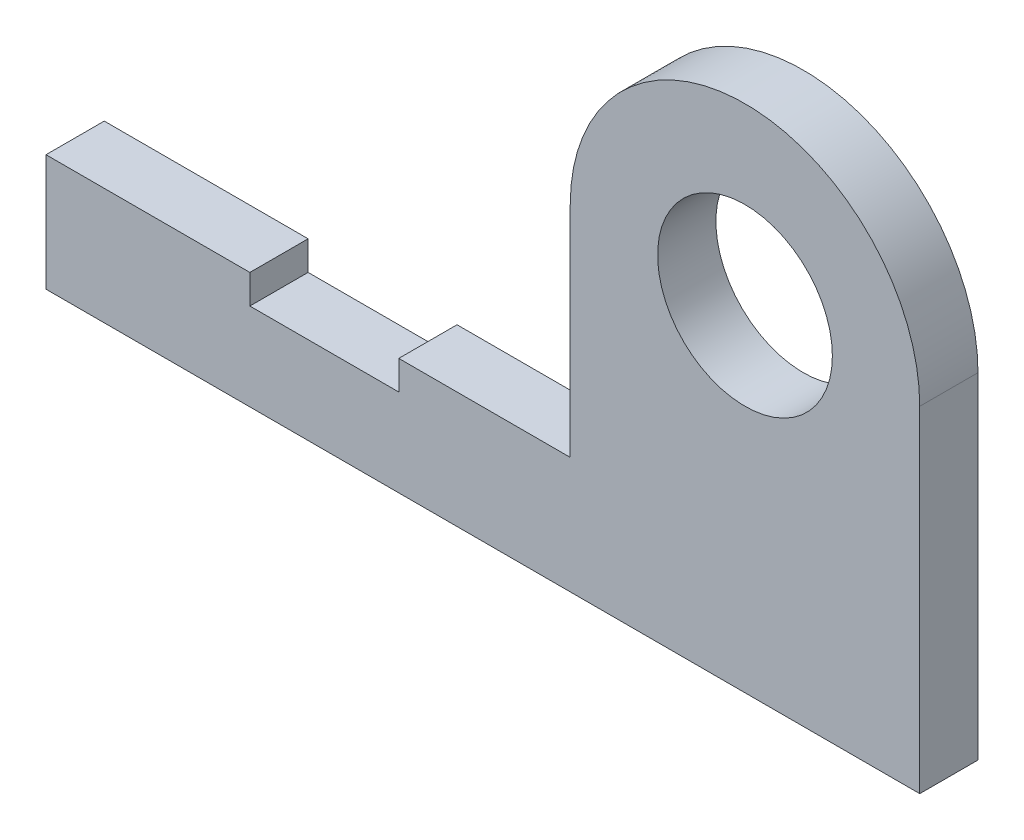
ISO-10303-21;
HEADER;
FILE_DESCRIPTION(('STEP AP214'),'2;1');
FILE_NAME('part.step','',(''),(''),'','','');
FILE_SCHEMA(('AUTOMOTIVE_DESIGN { 1 0 10303 214 1 1 1 1 }'));
ENDSEC;
DATA;
#1=APPLICATION_CONTEXT('core data for automotive mechanical design processes');
#2=APPLICATION_PROTOCOL_DEFINITION('international standard','automotive_design',2000,#1);
#3=PRODUCT_CONTEXT('',#1,'mechanical');
#4=PRODUCT('Part','Part','',(#3));
#5=PRODUCT_RELATED_PRODUCT_CATEGORY('part','',(#4));
#6=PRODUCT_DEFINITION_FORMATION('','',#4);
#7=PRODUCT_DEFINITION_CONTEXT('part definition',#1,'design');
#8=PRODUCT_DEFINITION('design','',#6,#7);
#9=PRODUCT_DEFINITION_SHAPE('','',#8);
#10=(LENGTH_UNIT() NAMED_UNIT(*) SI_UNIT(.MILLI.,.METRE.));
#11=(NAMED_UNIT(*) PLANE_ANGLE_UNIT() SI_UNIT($,.RADIAN.));
#12=(NAMED_UNIT(*) SI_UNIT($,.STERADIAN.) SOLID_ANGLE_UNIT());
#13=UNCERTAINTY_MEASURE_WITH_UNIT(LENGTH_MEASURE(1.E-05),#10,'distance_accuracy_value','');
#14=(GEOMETRIC_REPRESENTATION_CONTEXT(3) GLOBAL_UNCERTAINTY_ASSIGNED_CONTEXT((#13)) GLOBAL_UNIT_ASSIGNED_CONTEXT((#10,
#11,#12)) REPRESENTATION_CONTEXT('',''));
#15=CARTESIAN_POINT('',(0.,0.,0.));
#16=DIRECTION('',(0.,0.,1.));
#17=DIRECTION('',(1.,0.,0.));
#18=AXIS2_PLACEMENT_3D('',#15,#16,#17);
#19=CARTESIAN_POINT('',(120.,57.593984962406,5.));
#20=DIRECTION('',(0.,0.,-1.));
#21=DIRECTION('',(-1.,0.,0.));
#22=AXIS2_PLACEMENT_3D('',#19,#20,#21);
#23=PLANE('',#22);
#24=DIRECTION('',(1.,0.,0.));
#25=VECTOR('',#24,1.);
#26=CARTESIAN_POINT('',(150.,0.,5.));
#27=LINE('',#26,#25);
#28=CARTESIAN_POINT('',(0.,0.,5.));
#29=VERTEX_POINT('',#28);
#30=CARTESIAN_POINT('',(150.,0.,5.));
#31=VERTEX_POINT('',#30);
#32=EDGE_CURVE('E188',#29,#31,#27,.T.);
#33=ORIENTED_EDGE('',*,*,#32,.T.);
#34=DIRECTION('',(0.,1.,0.));
#35=VECTOR('',#34,1.);
#36=CARTESIAN_POINT('',(150.,57.593984962406,5.));
#37=LINE('',#36,#35);
#38=CARTESIAN_POINT('',(150.,57.593984962406,5.));
#39=VERTEX_POINT('',#38);
#40=EDGE_CURVE('E112',#31,#39,#37,.T.);
#41=ORIENTED_EDGE('',*,*,#40,.T.);
#42=CARTESIAN_POINT('',(120.,57.593984962406,5.));
#43=DIRECTION('',(0.,0.,1.));
#44=DIRECTION('',(-1.,0.,0.));
#45=AXIS2_PLACEMENT_3D('',#42,#43,#44);
#46=CIRCLE('',#45,30.);
#47=CARTESIAN_POINT('',(90.,57.593984962406,5.));
#48=VERTEX_POINT('',#47);
#49=EDGE_CURVE('E217',#39,#48,#46,.T.);
#50=ORIENTED_EDGE('',*,*,#49,.T.);
#51=DIRECTION('',(0.,-1.,0.));
#52=VECTOR('',#51,1.);
#53=CARTESIAN_POINT('',(90.,20.,5.));
#54=LINE('',#53,#52);
#55=CARTESIAN_POINT('',(90.,20.,5.));
#56=VERTEX_POINT('',#55);
#57=EDGE_CURVE('E237',#48,#56,#54,.T.);
#58=ORIENTED_EDGE('',*,*,#57,.T.);
#59=DIRECTION('',(-1.,0.,0.));
#60=VECTOR('',#59,1.);
#61=CARTESIAN_POINT('',(60.5639097744361,20.,5.));
#62=LINE('',#61,#60);
#63=CARTESIAN_POINT('',(60.5639097744361,20.,5.));
#64=VERTEX_POINT('',#63);
#65=EDGE_CURVE('E233',#56,#64,#62,.T.);
#66=ORIENTED_EDGE('',*,*,#65,.T.);
#67=DIRECTION('',(0.,-1.,0.));
#68=VECTOR('',#67,1.);
#69=CARTESIAN_POINT('',(60.5639097744361,15.,5.));
#70=LINE('',#69,#68);
#71=CARTESIAN_POINT('',(60.5639097744361,15.,5.));
#72=VERTEX_POINT('',#71);
#73=EDGE_CURVE('E236',#64,#72,#70,.T.);
#74=ORIENTED_EDGE('',*,*,#73,.T.);
#75=DIRECTION('',(-1.,0.,0.));
#76=VECTOR('',#75,1.);
#77=CARTESIAN_POINT('',(35.,15.,5.));
#78=LINE('',#77,#76);
#79=CARTESIAN_POINT('',(35.,15.,5.));
#80=VERTEX_POINT('',#79);
#81=EDGE_CURVE('E137',#72,#80,#78,.T.);
#82=ORIENTED_EDGE('',*,*,#81,.T.);
#83=DIRECTION('',(0.,1.,0.));
#84=VECTOR('',#83,1.);
#85=CARTESIAN_POINT('',(35.,20.,5.));
#86=LINE('',#85,#84);
#87=CARTESIAN_POINT('',(35.,20.,5.));
#88=VERTEX_POINT('',#87);
#89=EDGE_CURVE('E131',#80,#88,#86,.T.);
#90=ORIENTED_EDGE('',*,*,#89,.T.);
#91=DIRECTION('',(-1.,0.,0.));
#92=VECTOR('',#91,1.);
#93=CARTESIAN_POINT('',(0.,20.,5.));
#94=LINE('',#93,#92);
#95=CARTESIAN_POINT('',(0.,20.,5.));
#96=VERTEX_POINT('',#95);
#97=EDGE_CURVE('E135',#88,#96,#94,.T.);
#98=ORIENTED_EDGE('',*,*,#97,.T.);
#99=DIRECTION('',(0.,-1.,0.));
#100=VECTOR('',#99,1.);
#101=CARTESIAN_POINT('',(0.,0.,5.));
#102=LINE('',#101,#100);
#103=EDGE_CURVE('E63',#96,#29,#102,.T.);
#104=ORIENTED_EDGE('',*,*,#103,.T.);
#105=EDGE_LOOP('',(#33,#41,#50,#58,#66,#74,#82,#90,#98,#104));
#106=FACE_BOUND('',#105,.T.);
#107=CARTESIAN_POINT('',(120.,57.593984962406,5.));
#108=DIRECTION('',(0.,0.,1.));
#109=DIRECTION('',(1.,0.,0.));
#110=AXIS2_PLACEMENT_3D('',#107,#108,#109);
#111=CIRCLE('',#110,15.);
#112=CARTESIAN_POINT('',(135.,57.593984962406,5.));
#113=VERTEX_POINT('',#112);
#114=EDGE_CURVE('E164',#113,#113,#111,.T.);
#115=ORIENTED_EDGE('',*,*,#114,.F.);
#116=EDGE_LOOP('',(#115));
#117=FACE_BOUND('',#116,.T.);
#118=ADVANCED_FACE('F45',(#106,#117),#23,.F.);
#119=CARTESIAN_POINT('',(120.,57.593984962406,-5.));
#120=DIRECTION('',(0.,0.,-1.));
#121=DIRECTION('',(-1.,0.,0.));
#122=AXIS2_PLACEMENT_3D('',#119,#120,#121);
#123=PLANE('',#122);
#124=DIRECTION('',(1.,0.,0.));
#125=VECTOR('',#124,1.);
#126=CARTESIAN_POINT('',(150.,0.,-5.));
#127=LINE('',#126,#125);
#128=CARTESIAN_POINT('',(0.,0.,-5.));
#129=VERTEX_POINT('',#128);
#130=CARTESIAN_POINT('',(150.,0.,-5.));
#131=VERTEX_POINT('',#130);
#132=EDGE_CURVE('E159',#129,#131,#127,.T.);
#133=ORIENTED_EDGE('',*,*,#132,.F.);
#134=DIRECTION('',(0.,-1.,0.));
#135=VECTOR('',#134,1.);
#136=CARTESIAN_POINT('',(0.,0.,-5.));
#137=LINE('',#136,#135);
#138=CARTESIAN_POINT('',(0.,20.,-5.));
#139=VERTEX_POINT('',#138);
#140=EDGE_CURVE('E104',#139,#129,#137,.T.);
#141=ORIENTED_EDGE('',*,*,#140,.F.);
#142=DIRECTION('',(-1.,0.,0.));
#143=VECTOR('',#142,1.);
#144=CARTESIAN_POINT('',(0.,20.,-5.));
#145=LINE('',#144,#143);
#146=CARTESIAN_POINT('',(35.,20.,-5.));
#147=VERTEX_POINT('',#146);
#148=EDGE_CURVE('E98',#147,#139,#145,.T.);
#149=ORIENTED_EDGE('',*,*,#148,.F.);
#150=DIRECTION('',(0.,1.,0.));
#151=VECTOR('',#150,1.);
#152=CARTESIAN_POINT('',(35.,20.,-5.));
#153=LINE('',#152,#151);
#154=CARTESIAN_POINT('',(35.,15.,-5.));
#155=VERTEX_POINT('',#154);
#156=EDGE_CURVE('E146',#155,#147,#153,.T.);
#157=ORIENTED_EDGE('',*,*,#156,.F.);
#158=DIRECTION('',(-1.,0.,0.));
#159=VECTOR('',#158,1.);
#160=CARTESIAN_POINT('',(35.,15.,-5.));
#161=LINE('',#160,#159);
#162=CARTESIAN_POINT('',(60.5639097744361,15.,-5.));
#163=VERTEX_POINT('',#162);
#164=EDGE_CURVE('E179',#163,#155,#161,.T.);
#165=ORIENTED_EDGE('',*,*,#164,.F.);
#166=DIRECTION('',(0.,-1.,0.));
#167=VECTOR('',#166,1.);
#168=CARTESIAN_POINT('',(60.5639097744361,15.,-5.));
#169=LINE('',#168,#167);
#170=CARTESIAN_POINT('',(60.5639097744361,20.,-5.));
#171=VERTEX_POINT('',#170);
#172=EDGE_CURVE('E176',#171,#163,#169,.T.);
#173=ORIENTED_EDGE('',*,*,#172,.F.);
#174=DIRECTION('',(-1.,0.,0.));
#175=VECTOR('',#174,1.);
#176=CARTESIAN_POINT('',(60.5639097744361,20.,-5.));
#177=LINE('',#176,#175);
#178=CARTESIAN_POINT('',(90.,20.,-5.));
#179=VERTEX_POINT('',#178);
#180=EDGE_CURVE('E173',#179,#171,#177,.T.);
#181=ORIENTED_EDGE('',*,*,#180,.F.);
#182=DIRECTION('',(0.,-1.,0.));
#183=VECTOR('',#182,1.);
#184=CARTESIAN_POINT('',(90.,20.,-5.));
#185=LINE('',#184,#183);
#186=CARTESIAN_POINT('',(90.,57.593984962406,-5.));
#187=VERTEX_POINT('',#186);
#188=EDGE_CURVE('E170',#187,#179,#185,.T.);
#189=ORIENTED_EDGE('',*,*,#188,.F.);
#190=CARTESIAN_POINT('',(120.,57.593984962406,-5.));
#191=DIRECTION('',(0.,0.,1.));
#192=DIRECTION('',(-1.,0.,0.));
#193=AXIS2_PLACEMENT_3D('',#190,#191,#192);
#194=CIRCLE('',#193,30.);
#195=CARTESIAN_POINT('',(150.,57.593984962406,-5.));
#196=VERTEX_POINT('',#195);
#197=EDGE_CURVE('E167',#196,#187,#194,.T.);
#198=ORIENTED_EDGE('',*,*,#197,.F.);
#199=DIRECTION('',(0.,1.,0.));
#200=VECTOR('',#199,1.);
#201=CARTESIAN_POINT('',(150.,57.593984962406,-5.));
#202=LINE('',#201,#200);
#203=EDGE_CURVE('E163',#131,#196,#202,.T.);
#204=ORIENTED_EDGE('',*,*,#203,.F.);
#205=EDGE_LOOP('',(#133,#141,#149,#157,#165,#173,#181,#189,#198,#204));
#206=FACE_BOUND('',#205,.T.);
#207=CARTESIAN_POINT('',(120.,57.593984962406,-5.));
#208=DIRECTION('',(0.,0.,1.));
#209=DIRECTION('',(1.,0.,0.));
#210=AXIS2_PLACEMENT_3D('',#207,#208,#209);
#211=CIRCLE('',#210,15.);
#212=CARTESIAN_POINT('',(135.,57.593984962406,-5.));
#213=VERTEX_POINT('',#212);
#214=EDGE_CURVE('E251',#213,#213,#211,.T.);
#215=ORIENTED_EDGE('',*,*,#214,.T.);
#216=EDGE_LOOP('',(#215));
#217=FACE_BOUND('',#216,.T.);
#218=ADVANCED_FACE('F221',(#206,#217),#123,.T.);
#219=CARTESIAN_POINT('',(150.,0.,5.));
#220=DIRECTION('',(0.,1.,0.));
#221=DIRECTION('',(-1.,0.,0.));
#222=AXIS2_PLACEMENT_3D('',#219,#220,#221);
#223=PLANE('',#222);
#224=ORIENTED_EDGE('',*,*,#132,.T.);
#225=DIRECTION('',(0.,0.,-1.));
#226=VECTOR('',#225,1.);
#227=CARTESIAN_POINT('',(150.,0.,5.));
#228=LINE('',#227,#226);
#229=EDGE_CURVE('E11',#31,#131,#228,.T.);
#230=ORIENTED_EDGE('',*,*,#229,.F.);
#231=ORIENTED_EDGE('',*,*,#32,.F.);
#232=DIRECTION('',(0.,0.,-1.));
#233=VECTOR('',#232,1.);
#234=CARTESIAN_POINT('',(0.,0.,5.));
#235=LINE('',#234,#233);
#236=EDGE_CURVE('E155',#29,#129,#235,.T.);
#237=ORIENTED_EDGE('',*,*,#236,.T.);
#238=EDGE_LOOP('',(#224,#230,#231,#237));
#239=FACE_BOUND('',#238,.T.);
#240=ADVANCED_FACE('F47',(#239),#223,.F.);
#241=CARTESIAN_POINT('',(150.,57.593984962406,5.));
#242=DIRECTION('',(-1.,0.,0.));
#243=DIRECTION('',(0.,-1.,0.));
#244=AXIS2_PLACEMENT_3D('',#241,#242,#243);
#245=PLANE('',#244);
#246=ORIENTED_EDGE('',*,*,#203,.T.);
#247=DIRECTION('',(0.,0.,-1.));
#248=VECTOR('',#247,1.);
#249=CARTESIAN_POINT('',(150.,57.593984962406,5.));
#250=LINE('',#249,#248);
#251=EDGE_CURVE('E55',#39,#196,#250,.T.);
#252=ORIENTED_EDGE('',*,*,#251,.F.);
#253=ORIENTED_EDGE('',*,*,#40,.F.);
#254=ORIENTED_EDGE('',*,*,#229,.T.);
#255=EDGE_LOOP('',(#246,#252,#253,#254));
#256=FACE_BOUND('',#255,.T.);
#257=ADVANCED_FACE('F289',(#256),#245,.F.);
#258=CARTESIAN_POINT('',(120.,57.593984962406,5.));
#259=DIRECTION('',(0.,0.,-1.));
#260=DIRECTION('',(-1.,0.,0.));
#261=AXIS2_PLACEMENT_3D('',#258,#259,#260);
#262=CYLINDRICAL_SURFACE('',#261,30.);
#263=ORIENTED_EDGE('',*,*,#197,.T.);
#264=DIRECTION('',(0.,0.,-1.));
#265=VECTOR('',#264,1.);
#266=CARTESIAN_POINT('',(90.,57.593984962406,5.));
#267=LINE('',#266,#265);
#268=EDGE_CURVE('E207',#48,#187,#267,.T.);
#269=ORIENTED_EDGE('',*,*,#268,.F.);
#270=ORIENTED_EDGE('',*,*,#49,.F.);
#271=ORIENTED_EDGE('',*,*,#251,.T.);
#272=EDGE_LOOP('',(#263,#269,#270,#271));
#273=FACE_BOUND('',#272,.T.);
#274=ADVANCED_FACE('F215',(#273),#262,.T.);
#275=CARTESIAN_POINT('',(90.,20.,5.));
#276=DIRECTION('',(1.,0.,0.));
#277=DIRECTION('',(0.,1.,0.));
#278=AXIS2_PLACEMENT_3D('',#275,#276,#277);
#279=PLANE('',#278);
#280=ORIENTED_EDGE('',*,*,#188,.T.);
#281=DIRECTION('',(0.,0.,-1.));
#282=VECTOR('',#281,1.);
#283=CARTESIAN_POINT('',(90.,20.,5.));
#284=LINE('',#283,#282);
#285=EDGE_CURVE('E203',#56,#179,#284,.T.);
#286=ORIENTED_EDGE('',*,*,#285,.F.);
#287=ORIENTED_EDGE('',*,*,#57,.F.);
#288=ORIENTED_EDGE('',*,*,#268,.T.);
#289=EDGE_LOOP('',(#280,#286,#287,#288));
#290=FACE_BOUND('',#289,.T.);
#291=ADVANCED_FACE('F227',(#290),#279,.F.);
#292=CARTESIAN_POINT('',(60.5639097744361,20.,5.));
#293=DIRECTION('',(0.,-1.,0.));
#294=DIRECTION('',(0.,0.,-1.));
#295=AXIS2_PLACEMENT_3D('',#292,#293,#294);
#296=PLANE('',#295);
#297=ORIENTED_EDGE('',*,*,#180,.T.);
#298=DIRECTION('',(0.,0.,-1.));
#299=VECTOR('',#298,1.);
#300=CARTESIAN_POINT('',(60.5639097744361,20.,5.));
#301=LINE('',#300,#299);
#302=EDGE_CURVE('E199',#64,#171,#301,.T.);
#303=ORIENTED_EDGE('',*,*,#302,.F.);
#304=ORIENTED_EDGE('',*,*,#65,.F.);
#305=ORIENTED_EDGE('',*,*,#285,.T.);
#306=EDGE_LOOP('',(#297,#303,#304,#305));
#307=FACE_BOUND('',#306,.T.);
#308=ADVANCED_FACE('F231',(#307),#296,.F.);
#309=CARTESIAN_POINT('',(60.5639097744361,15.,5.));
#310=DIRECTION('',(1.,0.,0.));
#311=DIRECTION('',(0.,0.,-1.));
#312=AXIS2_PLACEMENT_3D('',#309,#310,#311);
#313=PLANE('',#312);
#314=ORIENTED_EDGE('',*,*,#172,.T.);
#315=DIRECTION('',(0.,0.,-1.));
#316=VECTOR('',#315,1.);
#317=CARTESIAN_POINT('',(60.5639097744361,15.,5.));
#318=LINE('',#317,#316);
#319=EDGE_CURVE('E195',#72,#163,#318,.T.);
#320=ORIENTED_EDGE('',*,*,#319,.F.);
#321=ORIENTED_EDGE('',*,*,#73,.F.);
#322=ORIENTED_EDGE('',*,*,#302,.T.);
#323=EDGE_LOOP('',(#314,#320,#321,#322));
#324=FACE_BOUND('',#323,.T.);
#325=ADVANCED_FACE('F279',(#324),#313,.F.);
#326=CARTESIAN_POINT('',(35.,15.,5.));
#327=DIRECTION('',(0.,-1.,0.));
#328=DIRECTION('',(0.,0.,-1.));
#329=AXIS2_PLACEMENT_3D('',#326,#327,#328);
#330=PLANE('',#329);
#331=ORIENTED_EDGE('',*,*,#164,.T.);
#332=DIRECTION('',(0.,0.,-1.));
#333=VECTOR('',#332,1.);
#334=CARTESIAN_POINT('',(35.,15.,5.));
#335=LINE('',#334,#333);
#336=EDGE_CURVE('E148',#80,#155,#335,.T.);
#337=ORIENTED_EDGE('',*,*,#336,.F.);
#338=ORIENTED_EDGE('',*,*,#81,.F.);
#339=ORIENTED_EDGE('',*,*,#319,.T.);
#340=EDGE_LOOP('',(#331,#337,#338,#339));
#341=FACE_BOUND('',#340,.T.);
#342=ADVANCED_FACE('F276',(#341),#330,.F.);
#343=CARTESIAN_POINT('',(35.,20.,5.));
#344=DIRECTION('',(-1.,0.,0.));
#345=DIRECTION('',(0.,0.,1.));
#346=AXIS2_PLACEMENT_3D('',#343,#344,#345);
#347=PLANE('',#346);
#348=ORIENTED_EDGE('',*,*,#156,.T.);
#349=DIRECTION('',(0.,0.,-1.));
#350=VECTOR('',#349,1.);
#351=CARTESIAN_POINT('',(35.,20.,5.));
#352=LINE('',#351,#350);
#353=EDGE_CURVE('E143',#88,#147,#352,.T.);
#354=ORIENTED_EDGE('',*,*,#353,.F.);
#355=ORIENTED_EDGE('',*,*,#89,.F.);
#356=ORIENTED_EDGE('',*,*,#336,.T.);
#357=EDGE_LOOP('',(#348,#354,#355,#356));
#358=FACE_BOUND('',#357,.T.);
#359=ADVANCED_FACE('F144',(#358),#347,.F.);
#360=CARTESIAN_POINT('',(0.,20.,5.));
#361=DIRECTION('',(0.,-1.,0.));
#362=DIRECTION('',(0.,0.,-1.));
#363=AXIS2_PLACEMENT_3D('',#360,#361,#362);
#364=PLANE('',#363);
#365=ORIENTED_EDGE('',*,*,#148,.T.);
#366=DIRECTION('',(0.,0.,-1.));
#367=VECTOR('',#366,1.);
#368=CARTESIAN_POINT('',(0.,20.,5.));
#369=LINE('',#368,#367);
#370=EDGE_CURVE('E149',#96,#139,#369,.T.);
#371=ORIENTED_EDGE('',*,*,#370,.F.);
#372=ORIENTED_EDGE('',*,*,#97,.F.);
#373=ORIENTED_EDGE('',*,*,#353,.T.);
#374=EDGE_LOOP('',(#365,#371,#372,#373));
#375=FACE_BOUND('',#374,.T.);
#376=ADVANCED_FACE('F151',(#375),#364,.F.);
#377=CARTESIAN_POINT('',(0.,0.,5.));
#378=DIRECTION('',(1.,0.,0.));
#379=DIRECTION('',(0.,0.,-1.));
#380=AXIS2_PLACEMENT_3D('',#377,#378,#379);
#381=PLANE('',#380);
#382=ORIENTED_EDGE('',*,*,#140,.T.);
#383=ORIENTED_EDGE('',*,*,#236,.F.);
#384=ORIENTED_EDGE('',*,*,#103,.F.);
#385=ORIENTED_EDGE('',*,*,#370,.T.);
#386=EDGE_LOOP('',(#382,#383,#384,#385));
#387=FACE_BOUND('',#386,.T.);
#388=ADVANCED_FACE('F269',(#387),#381,.F.);
#389=CARTESIAN_POINT('',(120.,57.593984962406,5.));
#390=DIRECTION('',(0.,0.,-1.));
#391=DIRECTION('',(-1.,0.,0.));
#392=AXIS2_PLACEMENT_3D('',#389,#390,#391);
#393=CYLINDRICAL_SURFACE('',#392,15.);
#394=ORIENTED_EDGE('',*,*,#114,.T.);
#395=EDGE_LOOP('',(#394));
#396=FACE_BOUND('',#395,.T.);
#397=ORIENTED_EDGE('',*,*,#214,.F.);
#398=EDGE_LOOP('',(#397));
#399=FACE_BOUND('',#398,.T.);
#400=ADVANCED_FACE('F259',(#396,#399),#393,.F.);
#401=CLOSED_SHELL('',(#118,#218,#240,#257,#274,#291,#308,#325,#342,#359,#376,#388,#400));
#402=MANIFOLD_SOLID_BREP('B2',#401);
#403=ADVANCED_BREP_SHAPE_REPRESENTATION('',(#18,#402),#14);
#404=SHAPE_DEFINITION_REPRESENTATION(#9,#403);
ENDSEC;
END-ISO-10303-21;
